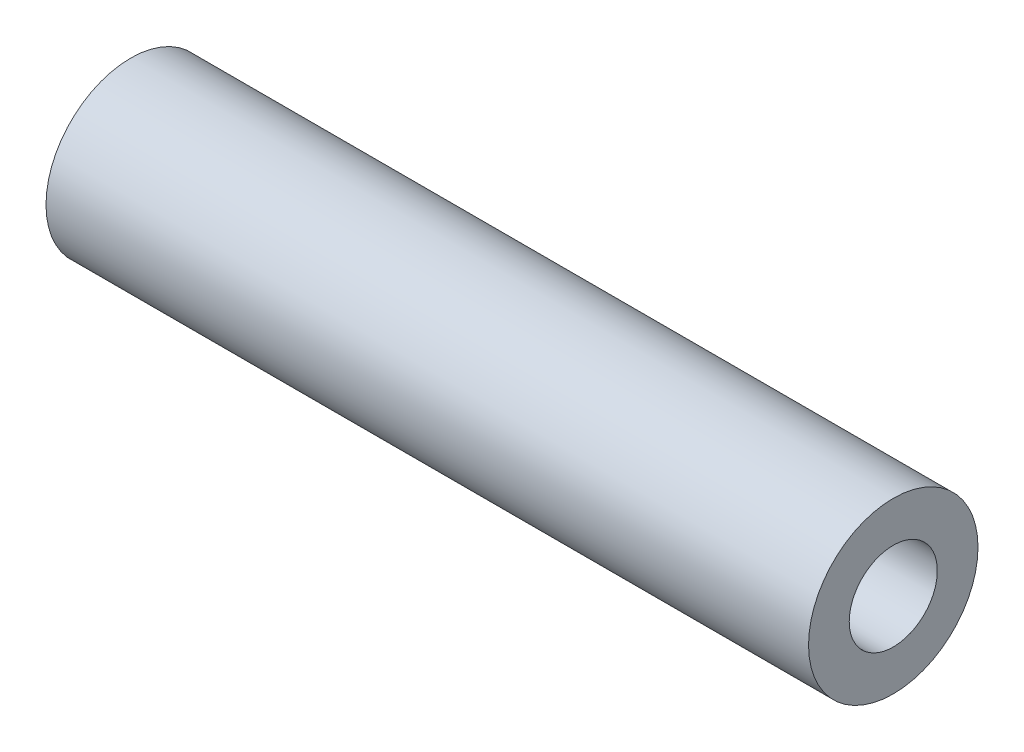
ISO-10303-21;
HEADER;
FILE_DESCRIPTION(('STEP AP214'),'2;1');
FILE_NAME('part.step','',(''),(''),'','','');
FILE_SCHEMA(('AUTOMOTIVE_DESIGN { 1 0 10303 214 1 1 1 1 }'));
ENDSEC;
DATA;
#1=APPLICATION_CONTEXT('core data for automotive mechanical design processes');
#2=APPLICATION_PROTOCOL_DEFINITION('international standard','automotive_design',2000,#1);
#3=PRODUCT_CONTEXT('',#1,'mechanical');
#4=PRODUCT('Part','Part','',(#3));
#5=PRODUCT_RELATED_PRODUCT_CATEGORY('part','',(#4));
#6=PRODUCT_DEFINITION_FORMATION('','',#4);
#7=PRODUCT_DEFINITION_CONTEXT('part definition',#1,'design');
#8=PRODUCT_DEFINITION('design','',#6,#7);
#9=PRODUCT_DEFINITION_SHAPE('','',#8);
#10=(LENGTH_UNIT() NAMED_UNIT(*) SI_UNIT(.MILLI.,.METRE.));
#11=(NAMED_UNIT(*) PLANE_ANGLE_UNIT() SI_UNIT($,.RADIAN.));
#12=(NAMED_UNIT(*) SI_UNIT($,.STERADIAN.) SOLID_ANGLE_UNIT());
#13=UNCERTAINTY_MEASURE_WITH_UNIT(LENGTH_MEASURE(1.E-05),#10,'distance_accuracy_value','');
#14=(GEOMETRIC_REPRESENTATION_CONTEXT(3) GLOBAL_UNCERTAINTY_ASSIGNED_CONTEXT((#13)) GLOBAL_UNIT_ASSIGNED_CONTEXT((#10,
#11,#12)) REPRESENTATION_CONTEXT('',''));
#15=CARTESIAN_POINT('',(0.,0.,0.));
#16=DIRECTION('',(0.,0.,1.));
#17=DIRECTION('',(1.,0.,0.));
#18=AXIS2_PLACEMENT_3D('',#15,#16,#17);
#19=CARTESIAN_POINT('',(45.,0.,0.));
#20=DIRECTION('',(1.,0.,0.));
#21=DIRECTION('',(0.,0.,-1.));
#22=AXIS2_PLACEMENT_3D('',#19,#20,#21);
#23=PLANE('',#22);
#24=CARTESIAN_POINT('',(45.,0.,0.));
#25=DIRECTION('',(1.,0.,0.));
#26=DIRECTION('',(0.,0.,-1.));
#27=AXIS2_PLACEMENT_3D('',#24,#25,#26);
#28=CIRCLE('',#27,5.);
#29=CARTESIAN_POINT('',(45.,0.,5.));
#30=VERTEX_POINT('',#29);
#31=EDGE_CURVE('E10',#30,#30,#28,.T.);
#32=ORIENTED_EDGE('',*,*,#31,.T.);
#33=EDGE_LOOP('',(#32));
#34=FACE_BOUND('',#33,.T.);
#35=CARTESIAN_POINT('',(45.,0.,0.));
#36=DIRECTION('',(1.,0.,0.));
#37=DIRECTION('',(0.,0.,-1.));
#38=AXIS2_PLACEMENT_3D('',#35,#36,#37);
#39=CIRCLE('',#38,2.6);
#40=CARTESIAN_POINT('',(45.,0.,2.6));
#41=VERTEX_POINT('',#40);
#42=EDGE_CURVE('E50',#41,#41,#39,.T.);
#43=ORIENTED_EDGE('',*,*,#42,.F.);
#44=EDGE_LOOP('',(#43));
#45=FACE_BOUND('',#44,.T.);
#46=ADVANCED_FACE('F37',(#34,#45),#23,.T.);
#47=CARTESIAN_POINT('',(0.,0.,0.));
#48=DIRECTION('',(1.,0.,0.));
#49=DIRECTION('',(0.,0.,-1.));
#50=AXIS2_PLACEMENT_3D('',#47,#48,#49);
#51=PLANE('',#50);
#52=CARTESIAN_POINT('',(0.,0.,0.));
#53=DIRECTION('',(1.,0.,0.));
#54=DIRECTION('',(0.,0.,-1.));
#55=AXIS2_PLACEMENT_3D('',#52,#53,#54);
#56=CIRCLE('',#55,5.);
#57=CARTESIAN_POINT('',(0.,0.,5.));
#58=VERTEX_POINT('',#57);
#59=EDGE_CURVE('E41',#58,#58,#56,.T.);
#60=ORIENTED_EDGE('',*,*,#59,.F.);
#61=EDGE_LOOP('',(#60));
#62=FACE_BOUND('',#61,.T.);
#63=CARTESIAN_POINT('',(0.,0.,0.));
#64=DIRECTION('',(1.,0.,0.));
#65=DIRECTION('',(0.,0.,-1.));
#66=AXIS2_PLACEMENT_3D('',#63,#64,#65);
#67=CIRCLE('',#66,2.6);
#68=CARTESIAN_POINT('',(0.,0.,2.6));
#69=VERTEX_POINT('',#68);
#70=EDGE_CURVE('E52',#69,#69,#67,.T.);
#71=ORIENTED_EDGE('',*,*,#70,.T.);
#72=EDGE_LOOP('',(#71));
#73=FACE_BOUND('',#72,.T.);
#74=ADVANCED_FACE('F64',(#62,#73),#51,.F.);
#75=CARTESIAN_POINT('',(45.,0.,0.));
#76=DIRECTION('',(-1.,0.,0.));
#77=DIRECTION('',(0.,0.,1.));
#78=AXIS2_PLACEMENT_3D('',#75,#76,#77);
#79=CYLINDRICAL_SURFACE('',#78,5.);
#80=CARTESIAN_POINT('',(45.,0.,5.));
#81=CARTESIAN_POINT('',(44.53125,0.,5.));
#82=CARTESIAN_POINT('',(44.0625,0.,5.));
#83=CARTESIAN_POINT('',(43.125,0.,5.));
#84=CARTESIAN_POINT('',(42.65625,0.,5.));
#85=CARTESIAN_POINT('',(41.71875,0.,5.));
#86=CARTESIAN_POINT('',(41.25,0.,5.));
#87=CARTESIAN_POINT('',(40.3125,0.,5.));
#88=CARTESIAN_POINT('',(39.84375,0.,5.));
#89=CARTESIAN_POINT('',(38.90625,0.,5.));
#90=CARTESIAN_POINT('',(38.4375,0.,5.));
#91=CARTESIAN_POINT('',(37.5,0.,5.));
#92=CARTESIAN_POINT('',(37.03125,0.,5.));
#93=CARTESIAN_POINT('',(36.09375,0.,5.));
#94=CARTESIAN_POINT('',(35.625,0.,5.));
#95=CARTESIAN_POINT('',(34.6875,0.,5.));
#96=CARTESIAN_POINT('',(34.21875,0.,5.));
#97=CARTESIAN_POINT('',(33.28125,0.,5.));
#98=CARTESIAN_POINT('',(32.8125,0.,5.));
#99=CARTESIAN_POINT('',(31.875,0.,5.));
#100=CARTESIAN_POINT('',(31.40625,0.,5.));
#101=CARTESIAN_POINT('',(30.46875,0.,5.));
#102=CARTESIAN_POINT('',(30.,0.,5.));
#103=CARTESIAN_POINT('',(29.0625,0.,5.));
#104=CARTESIAN_POINT('',(28.59375,0.,5.));
#105=CARTESIAN_POINT('',(27.65625,0.,5.));
#106=CARTESIAN_POINT('',(27.1875,0.,5.));
#107=CARTESIAN_POINT('',(26.25,0.,5.));
#108=CARTESIAN_POINT('',(25.78125,0.,5.));
#109=CARTESIAN_POINT('',(24.84375,0.,5.));
#110=CARTESIAN_POINT('',(24.375,0.,5.));
#111=CARTESIAN_POINT('',(23.4375,0.,5.));
#112=CARTESIAN_POINT('',(22.96875,0.,5.));
#113=CARTESIAN_POINT('',(22.03125,0.,5.));
#114=CARTESIAN_POINT('',(21.5625,0.,5.));
#115=CARTESIAN_POINT('',(20.625,0.,5.));
#116=CARTESIAN_POINT('',(20.15625,0.,5.));
#117=CARTESIAN_POINT('',(19.21875,0.,5.));
#118=CARTESIAN_POINT('',(18.75,0.,5.));
#119=CARTESIAN_POINT('',(17.8125,0.,5.));
#120=CARTESIAN_POINT('',(17.34375,0.,5.));
#121=CARTESIAN_POINT('',(16.40625,0.,5.));
#122=CARTESIAN_POINT('',(15.9375,0.,5.));
#123=CARTESIAN_POINT('',(15.,0.,5.));
#124=CARTESIAN_POINT('',(14.53125,0.,5.));
#125=CARTESIAN_POINT('',(13.59375,0.,5.));
#126=CARTESIAN_POINT('',(13.125,0.,5.));
#127=CARTESIAN_POINT('',(12.1875,0.,5.));
#128=CARTESIAN_POINT('',(11.71875,0.,5.));
#129=CARTESIAN_POINT('',(10.78125,0.,5.));
#130=CARTESIAN_POINT('',(10.3125,0.,5.));
#131=CARTESIAN_POINT('',(9.375,0.,5.));
#132=CARTESIAN_POINT('',(8.90625,0.,5.));
#133=CARTESIAN_POINT('',(7.96874999999999,0.,5.));
#134=CARTESIAN_POINT('',(7.5,0.,5.));
#135=CARTESIAN_POINT('',(6.5625,0.,5.));
#136=CARTESIAN_POINT('',(6.09375,0.,5.));
#137=CARTESIAN_POINT('',(5.15625,0.,5.));
#138=CARTESIAN_POINT('',(4.68749999999999,0.,5.));
#139=CARTESIAN_POINT('',(3.74999999999999,0.,5.));
#140=CARTESIAN_POINT('',(3.28124999999999,0.,5.));
#141=CARTESIAN_POINT('',(2.34374999999999,0.,5.));
#142=CARTESIAN_POINT('',(1.87499999999999,0.,5.));
#143=CARTESIAN_POINT('',(0.937499999999992,0.,5.));
#144=CARTESIAN_POINT('',(0.468749999999993,0.,5.));
#145=CARTESIAN_POINT('',(0.,0.,5.));
#146=B_SPLINE_CURVE_WITH_KNOTS('',3,(#80,#81,#82,#83,#84,#85,#86,#87,#88,#89,#90,#91,#92,#93,
#94,#95,#96,#97,#98,#99,#100,#101,#102,#103,#104,#105,#106,#107,#108,#109,#110,#111,#112,#113,
#114,#115,#116,#117,#118,#119,#120,#121,#122,#123,#124,#125,#126,#127,#128,#129,#130,#131,#132,
#133,#134,#135,#136,#137,#138,#139,#140,#141,#142,#143,#144,#145),.UNSPECIFIED.,.F.,.F.,(4,2,2,
2,2,2,2,2,2,2,2,2,2,2,2,2,2,2,2,2,2,2,2,2,2,2,2,2,2,2,2,2,4),(0.,1.40625,2.8125,
4.21875000000001,5.62500000000001,7.03125,8.4375,9.84375000000001,11.25,12.65625,14.0625,
15.46875,16.875,18.28125,19.6875,21.09375,22.5,23.90625,25.3125,26.71875,28.125,29.53125,
30.9375,32.34375,33.75,35.15625,36.5625,37.96875,39.375,40.78125,42.1875,43.59375,45.),.UNSPECIFIED.);
#147=EDGE_CURVE('BSEAM39',#30,#58,#146,.T.);
#148=ORIENTED_EDGE('',*,*,#31,.F.);
#149=ORIENTED_EDGE('',*,*,#59,.T.);
#150=ORIENTED_EDGE('',*,*,#147,.T.);
#151=ORIENTED_EDGE('',*,*,#147,.F.);
#152=EDGE_LOOP('',(#148,#150,#149,#151));
#153=FACE_BOUND('',#152,.T.);
#154=ADVANCED_FACE('F39',(#153),#79,.T.);
#155=CARTESIAN_POINT('',(45.,0.,0.));
#156=DIRECTION('',(-1.,0.,0.));
#157=DIRECTION('',(0.,0.,1.));
#158=AXIS2_PLACEMENT_3D('',#155,#156,#157);
#159=CYLINDRICAL_SURFACE('',#158,2.6);
#160=CARTESIAN_POINT('',(45.,0.,2.6));
#161=CARTESIAN_POINT('',(44.53125,0.,2.6));
#162=CARTESIAN_POINT('',(44.0625,0.,2.6));
#163=CARTESIAN_POINT('',(43.125,0.,2.6));
#164=CARTESIAN_POINT('',(42.65625,0.,2.6));
#165=CARTESIAN_POINT('',(41.71875,0.,2.6));
#166=CARTESIAN_POINT('',(41.25,0.,2.6));
#167=CARTESIAN_POINT('',(40.3125,0.,2.6));
#168=CARTESIAN_POINT('',(39.84375,0.,2.6));
#169=CARTESIAN_POINT('',(38.90625,0.,2.6));
#170=CARTESIAN_POINT('',(38.4375,0.,2.6));
#171=CARTESIAN_POINT('',(37.5,0.,2.6));
#172=CARTESIAN_POINT('',(37.03125,0.,2.6));
#173=CARTESIAN_POINT('',(36.09375,0.,2.6));
#174=CARTESIAN_POINT('',(35.625,0.,2.6));
#175=CARTESIAN_POINT('',(34.6875,0.,2.6));
#176=CARTESIAN_POINT('',(34.21875,0.,2.6));
#177=CARTESIAN_POINT('',(33.28125,0.,2.6));
#178=CARTESIAN_POINT('',(32.8125,0.,2.6));
#179=CARTESIAN_POINT('',(31.875,0.,2.6));
#180=CARTESIAN_POINT('',(31.40625,0.,2.6));
#181=CARTESIAN_POINT('',(30.46875,0.,2.6));
#182=CARTESIAN_POINT('',(30.,0.,2.6));
#183=CARTESIAN_POINT('',(29.0625,0.,2.6));
#184=CARTESIAN_POINT('',(28.59375,0.,2.6));
#185=CARTESIAN_POINT('',(27.65625,0.,2.6));
#186=CARTESIAN_POINT('',(27.1875,0.,2.6));
#187=CARTESIAN_POINT('',(26.25,0.,2.6));
#188=CARTESIAN_POINT('',(25.78125,0.,2.6));
#189=CARTESIAN_POINT('',(24.84375,0.,2.6));
#190=CARTESIAN_POINT('',(24.375,0.,2.6));
#191=CARTESIAN_POINT('',(23.4375,0.,2.6));
#192=CARTESIAN_POINT('',(22.96875,0.,2.6));
#193=CARTESIAN_POINT('',(22.03125,0.,2.6));
#194=CARTESIAN_POINT('',(21.5625,0.,2.6));
#195=CARTESIAN_POINT('',(20.625,0.,2.6));
#196=CARTESIAN_POINT('',(20.15625,0.,2.6));
#197=CARTESIAN_POINT('',(19.21875,0.,2.6));
#198=CARTESIAN_POINT('',(18.75,0.,2.6));
#199=CARTESIAN_POINT('',(17.8125,0.,2.6));
#200=CARTESIAN_POINT('',(17.34375,0.,2.6));
#201=CARTESIAN_POINT('',(16.40625,0.,2.6));
#202=CARTESIAN_POINT('',(15.9375,0.,2.6));
#203=CARTESIAN_POINT('',(15.,0.,2.6));
#204=CARTESIAN_POINT('',(14.53125,0.,2.6));
#205=CARTESIAN_POINT('',(13.59375,0.,2.6));
#206=CARTESIAN_POINT('',(13.125,0.,2.6));
#207=CARTESIAN_POINT('',(12.1875,0.,2.6));
#208=CARTESIAN_POINT('',(11.71875,0.,2.6));
#209=CARTESIAN_POINT('',(10.78125,0.,2.6));
#210=CARTESIAN_POINT('',(10.3125,0.,2.6));
#211=CARTESIAN_POINT('',(9.375,0.,2.6));
#212=CARTESIAN_POINT('',(8.90625,0.,2.6));
#213=CARTESIAN_POINT('',(7.96874999999999,0.,2.6));
#214=CARTESIAN_POINT('',(7.5,0.,2.6));
#215=CARTESIAN_POINT('',(6.5625,0.,2.6));
#216=CARTESIAN_POINT('',(6.09375,0.,2.6));
#217=CARTESIAN_POINT('',(5.15625,0.,2.6));
#218=CARTESIAN_POINT('',(4.68749999999999,0.,2.6));
#219=CARTESIAN_POINT('',(3.74999999999999,0.,2.6));
#220=CARTESIAN_POINT('',(3.28124999999999,0.,2.6));
#221=CARTESIAN_POINT('',(2.34374999999999,0.,2.6));
#222=CARTESIAN_POINT('',(1.87499999999999,0.,2.6));
#223=CARTESIAN_POINT('',(0.937499999999992,0.,2.6));
#224=CARTESIAN_POINT('',(0.468749999999993,0.,2.6));
#225=CARTESIAN_POINT('',(0.,0.,2.6));
#226=B_SPLINE_CURVE_WITH_KNOTS('',3,(#160,#161,#162,#163,#164,#165,#166,#167,#168,#169,#170,
#171,#172,#173,#174,#175,#176,#177,#178,#179,#180,#181,#182,#183,#184,#185,#186,#187,#188,#189,
#190,#191,#192,#193,#194,#195,#196,#197,#198,#199,#200,#201,#202,#203,#204,#205,#206,#207,#208,
#209,#210,#211,#212,#213,#214,#215,#216,#217,#218,#219,#220,#221,#222,#223,#224,#225),
.UNSPECIFIED.,.F.,.F.,(4,2,2,2,2,2,2,2,2,2,2,2,2,2,2,2,2,2,2,2,2,2,2,2,2,2,2,2,2,2,2,2,4),(0.,
1.40625,2.8125,4.21875000000001,5.62500000000001,7.03125,8.4375,9.84375000000001,11.25,12.65625,
14.0625,15.46875,16.875,18.28125,19.6875,21.09375,22.5,23.90625,25.3125,26.71875,28.125,
29.53125,30.9375,32.34375,33.75,35.15625,36.5625,37.96875,39.375,40.78125,42.1875,43.59375,45.),.UNSPECIFIED.);
#227=EDGE_CURVE('BSEAM60',#41,#69,#226,.T.);
#228=ORIENTED_EDGE('',*,*,#42,.T.);
#229=ORIENTED_EDGE('',*,*,#70,.F.);
#230=ORIENTED_EDGE('',*,*,#227,.T.);
#231=ORIENTED_EDGE('',*,*,#227,.F.);
#232=EDGE_LOOP('',(#228,#230,#229,#231));
#233=FACE_BOUND('',#232,.T.);
#234=ADVANCED_FACE('F60',(#233),#159,.F.);
#235=CLOSED_SHELL('',(#46,#74,#154,#234));
#236=MANIFOLD_SOLID_BREP('B2',#235);
#237=ADVANCED_BREP_SHAPE_REPRESENTATION('',(#18,#236),#14);
#238=SHAPE_DEFINITION_REPRESENTATION(#9,#237);
ENDSEC;
END-ISO-10303-21;
